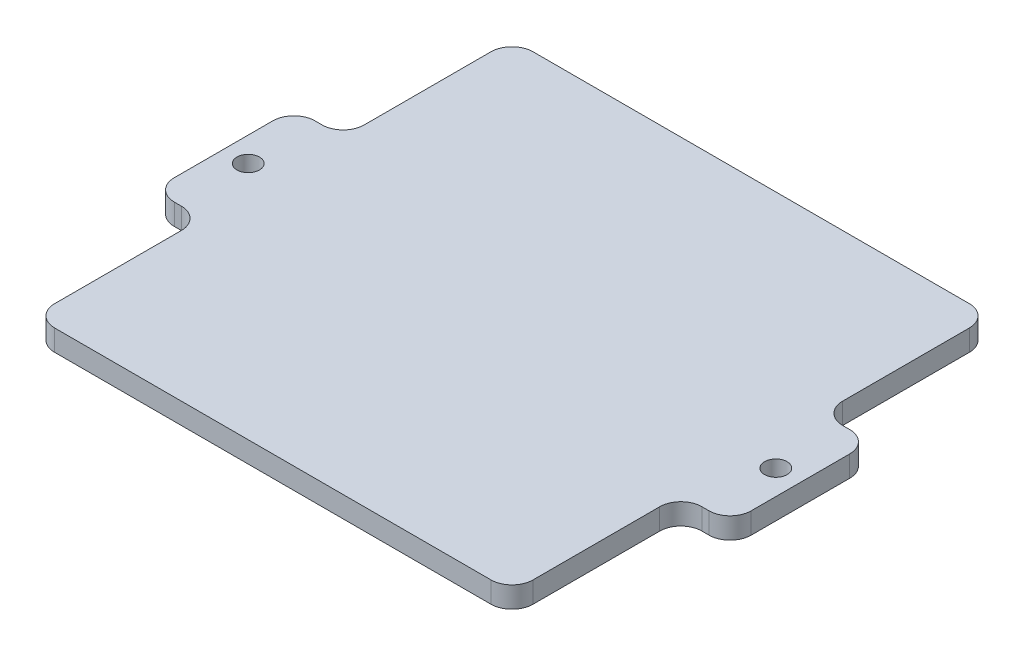
ISO-10303-21;
HEADER;
FILE_DESCRIPTION(('STEP AP214'),'2;1');
FILE_NAME('part.step','',(''),(''),'','','');
FILE_SCHEMA(('AUTOMOTIVE_DESIGN { 1 0 10303 214 1 1 1 1 }'));
ENDSEC;
DATA;
#1=APPLICATION_CONTEXT('core data for automotive mechanical design processes');
#2=APPLICATION_PROTOCOL_DEFINITION('international standard','automotive_design',2000,#1);
#3=PRODUCT_CONTEXT('',#1,'mechanical');
#4=PRODUCT('Part','Part','',(#3));
#5=PRODUCT_RELATED_PRODUCT_CATEGORY('part','',(#4));
#6=PRODUCT_DEFINITION_FORMATION('','',#4);
#7=PRODUCT_DEFINITION_CONTEXT('part definition',#1,'design');
#8=PRODUCT_DEFINITION('design','',#6,#7);
#9=PRODUCT_DEFINITION_SHAPE('','',#8);
#10=(LENGTH_UNIT() NAMED_UNIT(*) SI_UNIT(.MILLI.,.METRE.));
#11=(NAMED_UNIT(*) PLANE_ANGLE_UNIT() SI_UNIT($,.RADIAN.));
#12=(NAMED_UNIT(*) SI_UNIT($,.STERADIAN.) SOLID_ANGLE_UNIT());
#13=UNCERTAINTY_MEASURE_WITH_UNIT(LENGTH_MEASURE(1.E-05),#10,'distance_accuracy_value','');
#14=(GEOMETRIC_REPRESENTATION_CONTEXT(3) GLOBAL_UNCERTAINTY_ASSIGNED_CONTEXT((#13)) GLOBAL_UNIT_ASSIGNED_CONTEXT((#10,
#11,#12)) REPRESENTATION_CONTEXT('',''));
#15=CARTESIAN_POINT('',(0.,0.,0.));
#16=DIRECTION('',(0.,0.,1.));
#17=DIRECTION('',(1.,0.,0.));
#18=AXIS2_PLACEMENT_3D('',#15,#16,#17);
#19=CARTESIAN_POINT('',(-34.,3.,-34.));
#20=DIRECTION('',(1.,0.,0.));
#21=DIRECTION('',(0.,0.,-1.));
#22=AXIS2_PLACEMENT_3D('',#19,#20,#21);
#23=PLANE('',#22);
#24=DIRECTION('',(0.,0.,1.));
#25=VECTOR('',#24,1.);
#26=CARTESIAN_POINT('',(-34.,0.,-34.));
#27=LINE('',#26,#25);
#28=CARTESIAN_POINT('',(-34.,0.,13.));
#29=VERTEX_POINT('',#28);
#30=CARTESIAN_POINT('',(-34.,0.,31.));
#31=VERTEX_POINT('',#30);
#32=EDGE_CURVE('E229',#29,#31,#27,.T.);
#33=ORIENTED_EDGE('',*,*,#32,.T.);
#34=DIRECTION('',(0.,-1.,0.));
#35=VECTOR('',#34,1.);
#36=CARTESIAN_POINT('',(-34.,3.,31.));
#37=LINE('',#36,#35);
#38=CARTESIAN_POINT('',(-34.,3.,31.));
#39=VERTEX_POINT('',#38);
#40=EDGE_CURVE('E200',#31,#39,#37,.F.);
#41=ORIENTED_EDGE('',*,*,#40,.T.);
#42=DIRECTION('',(0.,0.,1.));
#43=VECTOR('',#42,1.);
#44=CARTESIAN_POINT('',(-34.,3.,-34.));
#45=LINE('',#44,#43);
#46=CARTESIAN_POINT('',(-34.,3.,13.));
#47=VERTEX_POINT('',#46);
#48=EDGE_CURVE('E264',#47,#39,#45,.T.);
#49=ORIENTED_EDGE('',*,*,#48,.F.);
#50=DIRECTION('',(0.,1.,0.));
#51=VECTOR('',#50,1.);
#52=CARTESIAN_POINT('',(-34.,3.,13.));
#53=LINE('',#52,#51);
#54=EDGE_CURVE('E205',#47,#29,#53,.F.);
#55=ORIENTED_EDGE('',*,*,#54,.T.);
#56=EDGE_LOOP('',(#33,#41,#49,#55));
#57=FACE_BOUND('',#56,.T.);
#58=ADVANCED_FACE('F33',(#57),#23,.F.);
#59=CARTESIAN_POINT('',(34.,3.,-34.));
#60=DIRECTION('',(-1.,0.,0.));
#61=DIRECTION('',(0.,0.,1.));
#62=AXIS2_PLACEMENT_3D('',#59,#60,#61);
#63=PLANE('',#62);
#64=DIRECTION('',(0.,0.,-1.));
#65=VECTOR('',#64,1.);
#66=CARTESIAN_POINT('',(34.,0.,-34.));
#67=LINE('',#66,#65);
#68=CARTESIAN_POINT('',(34.,0.,-13.));
#69=VERTEX_POINT('',#68);
#70=CARTESIAN_POINT('',(34.,0.,-31.));
#71=VERTEX_POINT('',#70);
#72=EDGE_CURVE('E275',#69,#71,#67,.T.);
#73=ORIENTED_EDGE('',*,*,#72,.T.);
#74=DIRECTION('',(0.,-1.,0.));
#75=VECTOR('',#74,1.);
#76=CARTESIAN_POINT('',(34.,3.,-31.));
#77=LINE('',#76,#75);
#78=CARTESIAN_POINT('',(34.,3.,-31.));
#79=VERTEX_POINT('',#78);
#80=EDGE_CURVE('E331',#71,#79,#77,.F.);
#81=ORIENTED_EDGE('',*,*,#80,.T.);
#82=DIRECTION('',(0.,0.,-1.));
#83=VECTOR('',#82,1.);
#84=CARTESIAN_POINT('',(34.,3.,-34.));
#85=LINE('',#84,#83);
#86=CARTESIAN_POINT('',(34.,3.,-13.));
#87=VERTEX_POINT('',#86);
#88=EDGE_CURVE('E222',#87,#79,#85,.T.);
#89=ORIENTED_EDGE('',*,*,#88,.F.);
#90=DIRECTION('',(0.,1.,0.));
#91=VECTOR('',#90,1.);
#92=CARTESIAN_POINT('',(34.,3.,-13.));
#93=LINE('',#92,#91);
#94=EDGE_CURVE('E329',#87,#69,#93,.F.);
#95=ORIENTED_EDGE('',*,*,#94,.T.);
#96=EDGE_LOOP('',(#73,#81,#89,#95));
#97=FACE_BOUND('',#96,.T.);
#98=ADVANCED_FACE('F488',(#97),#63,.F.);
#99=CARTESIAN_POINT('',(34.,3.,31.));
#100=VERTEX_POINT('',#99);
#101=CARTESIAN_POINT('',(34.,3.,13.));
#102=VERTEX_POINT('',#101);
#103=EDGE_CURVE('E226',#100,#102,#85,.T.);
#104=ORIENTED_EDGE('',*,*,#103,.F.);
#105=DIRECTION('',(0.,-1.,0.));
#106=VECTOR('',#105,1.);
#107=CARTESIAN_POINT('',(34.,3.,31.));
#108=LINE('',#107,#106);
#109=CARTESIAN_POINT('',(34.,0.,31.));
#110=VERTEX_POINT('',#109);
#111=EDGE_CURVE('E321',#100,#110,#108,.T.);
#112=ORIENTED_EDGE('',*,*,#111,.T.);
#113=CARTESIAN_POINT('',(34.,0.,13.));
#114=VERTEX_POINT('',#113);
#115=EDGE_CURVE('E278',#110,#114,#67,.T.);
#116=ORIENTED_EDGE('',*,*,#115,.T.);
#117=DIRECTION('',(0.,1.,0.));
#118=VECTOR('',#117,1.);
#119=CARTESIAN_POINT('',(34.,3.,13.));
#120=LINE('',#119,#118);
#121=EDGE_CURVE('E318',#114,#102,#120,.T.);
#122=ORIENTED_EDGE('',*,*,#121,.T.);
#123=EDGE_LOOP('',(#104,#112,#116,#122));
#124=FACE_BOUND('',#123,.T.);
#125=ADVANCED_FACE('F446',(#124),#63,.F.);
#126=CARTESIAN_POINT('',(-34.,3.,-34.));
#127=DIRECTION('',(0.,0.,1.));
#128=DIRECTION('',(1.,0.,0.));
#129=AXIS2_PLACEMENT_3D('',#126,#127,#128);
#130=PLANE('',#129);
#131=DIRECTION('',(-1.,0.,0.));
#132=VECTOR('',#131,1.);
#133=CARTESIAN_POINT('',(-34.,3.,-34.));
#134=LINE('',#133,#132);
#135=CARTESIAN_POINT('',(31.,3.,-34.));
#136=VERTEX_POINT('',#135);
#137=CARTESIAN_POINT('',(-31.,3.,-34.));
#138=VERTEX_POINT('',#137);
#139=EDGE_CURVE('E258',#136,#138,#134,.T.);
#140=ORIENTED_EDGE('',*,*,#139,.F.);
#141=DIRECTION('',(0.,-1.,0.));
#142=VECTOR('',#141,1.);
#143=CARTESIAN_POINT('',(31.,3.,-34.));
#144=LINE('',#143,#142);
#145=CARTESIAN_POINT('',(31.,0.,-34.));
#146=VERTEX_POINT('',#145);
#147=EDGE_CURVE('E326',#136,#146,#144,.T.);
#148=ORIENTED_EDGE('',*,*,#147,.T.);
#149=DIRECTION('',(-1.,0.,0.));
#150=VECTOR('',#149,1.);
#151=CARTESIAN_POINT('',(-34.,0.,-34.));
#152=LINE('',#151,#150);
#153=CARTESIAN_POINT('',(-31.,0.,-34.));
#154=VERTEX_POINT('',#153);
#155=EDGE_CURVE('E272',#146,#154,#152,.T.);
#156=ORIENTED_EDGE('',*,*,#155,.T.);
#157=DIRECTION('',(0.,-1.,0.));
#158=VECTOR('',#157,1.);
#159=CARTESIAN_POINT('',(-31.,3.,-34.));
#160=LINE('',#159,#158);
#161=EDGE_CURVE('E324',#154,#138,#160,.F.);
#162=ORIENTED_EDGE('',*,*,#161,.T.);
#163=EDGE_LOOP('',(#140,#148,#156,#162));
#164=FACE_BOUND('',#163,.T.);
#165=ADVANCED_FACE('F498',(#164),#130,.F.);
#166=CARTESIAN_POINT('',(-34.,3.,-31.));
#167=VERTEX_POINT('',#166);
#168=CARTESIAN_POINT('',(-34.,3.,-13.));
#169=VERTEX_POINT('',#168);
#170=EDGE_CURVE('E250',#167,#169,#45,.T.);
#171=ORIENTED_EDGE('',*,*,#170,.F.);
#172=DIRECTION('',(0.,-1.,0.));
#173=VECTOR('',#172,1.);
#174=CARTESIAN_POINT('',(-34.,3.,-31.));
#175=LINE('',#174,#173);
#176=CARTESIAN_POINT('',(-34.,0.,-31.));
#177=VERTEX_POINT('',#176);
#178=EDGE_CURVE('E336',#167,#177,#175,.T.);
#179=ORIENTED_EDGE('',*,*,#178,.T.);
#180=CARTESIAN_POINT('',(-34.,0.,-13.));
#181=VERTEX_POINT('',#180);
#182=EDGE_CURVE('E223',#177,#181,#27,.T.);
#183=ORIENTED_EDGE('',*,*,#182,.T.);
#184=DIRECTION('',(0.,1.,0.));
#185=VECTOR('',#184,1.);
#186=CARTESIAN_POINT('',(-34.,3.,-13.));
#187=LINE('',#186,#185);
#188=EDGE_CURVE('E333',#181,#169,#187,.T.);
#189=ORIENTED_EDGE('',*,*,#188,.T.);
#190=EDGE_LOOP('',(#171,#179,#183,#189));
#191=FACE_BOUND('',#190,.T.);
#192=ADVANCED_FACE('F394',(#191),#23,.F.);
#193=CARTESIAN_POINT('',(-34.,3.,34.));
#194=DIRECTION('',(0.,0.,-1.));
#195=DIRECTION('',(-1.,0.,0.));
#196=AXIS2_PLACEMENT_3D('',#193,#194,#195);
#197=PLANE('',#196);
#198=DIRECTION('',(1.,0.,0.));
#199=VECTOR('',#198,1.);
#200=CARTESIAN_POINT('',(-34.,3.,34.));
#201=LINE('',#200,#199);
#202=CARTESIAN_POINT('',(-31.,3.,34.));
#203=VERTEX_POINT('',#202);
#204=CARTESIAN_POINT('',(31.,3.,34.));
#205=VERTEX_POINT('',#204);
#206=EDGE_CURVE('E215',#203,#205,#201,.T.);
#207=ORIENTED_EDGE('',*,*,#206,.F.);
#208=DIRECTION('',(0.,-1.,0.));
#209=VECTOR('',#208,1.);
#210=CARTESIAN_POINT('',(-31.,3.,34.));
#211=LINE('',#210,#209);
#212=CARTESIAN_POINT('',(-31.,0.,34.));
#213=VERTEX_POINT('',#212);
#214=EDGE_CURVE('E199',#203,#213,#211,.T.);
#215=ORIENTED_EDGE('',*,*,#214,.T.);
#216=DIRECTION('',(1.,0.,0.));
#217=VECTOR('',#216,1.);
#218=CARTESIAN_POINT('',(-34.,0.,34.));
#219=LINE('',#218,#217);
#220=CARTESIAN_POINT('',(31.,0.,34.));
#221=VERTEX_POINT('',#220);
#222=EDGE_CURVE('E212',#213,#221,#219,.T.);
#223=ORIENTED_EDGE('',*,*,#222,.T.);
#224=DIRECTION('',(0.,-1.,0.));
#225=VECTOR('',#224,1.);
#226=CARTESIAN_POINT('',(31.,3.,34.));
#227=LINE('',#226,#225);
#228=EDGE_CURVE('E217',#221,#205,#227,.F.);
#229=ORIENTED_EDGE('',*,*,#228,.T.);
#230=EDGE_LOOP('',(#207,#215,#223,#229));
#231=FACE_BOUND('',#230,.T.);
#232=ADVANCED_FACE('F211',(#231),#197,.F.);
#233=CARTESIAN_POINT('',(0.,3.,0.));
#234=DIRECTION('',(0.,1.,0.));
#235=DIRECTION('',(0.,0.,1.));
#236=AXIS2_PLACEMENT_3D('',#233,#234,#235);
#237=PLANE('',#236);
#238=ORIENTED_EDGE('',*,*,#48,.T.);
#239=CARTESIAN_POINT('',(-31.,3.,31.));
#240=DIRECTION('',(0.,1.,0.));
#241=DIRECTION('',(0.,0.,1.));
#242=AXIS2_PLACEMENT_3D('',#239,#240,#241);
#243=CIRCLE('',#242,3.);
#244=EDGE_CURVE('E316',#39,#203,#243,.T.);
#245=ORIENTED_EDGE('',*,*,#244,.T.);
#246=ORIENTED_EDGE('',*,*,#206,.T.);
#247=CARTESIAN_POINT('',(31.,3.,31.));
#248=DIRECTION('',(0.,1.,0.));
#249=DIRECTION('',(0.,0.,1.));
#250=AXIS2_PLACEMENT_3D('',#247,#248,#249);
#251=CIRCLE('',#250,3.);
#252=EDGE_CURVE('E314',#205,#100,#251,.T.);
#253=ORIENTED_EDGE('',*,*,#252,.T.);
#254=ORIENTED_EDGE('',*,*,#103,.T.);
#255=CARTESIAN_POINT('',(37.,3.,13.));
#256=DIRECTION('',(0.,1.,0.));
#257=DIRECTION('',(0.,0.,1.));
#258=AXIS2_PLACEMENT_3D('',#255,#256,#257);
#259=CIRCLE('',#258,3.);
#260=CARTESIAN_POINT('',(37.,3.,10.));
#261=VERTEX_POINT('',#260);
#262=EDGE_CURVE('E368',#102,#261,#259,.F.);
#263=ORIENTED_EDGE('',*,*,#262,.T.);
#264=DIRECTION('',(1.,0.,0.));
#265=VECTOR('',#264,1.);
#266=CARTESIAN_POINT('',(41.,3.,10.));
#267=LINE('',#266,#265);
#268=CARTESIAN_POINT('',(38.,3.,10.));
#269=VERTEX_POINT('',#268);
#270=EDGE_CURVE('E245',#261,#269,#267,.T.);
#271=ORIENTED_EDGE('',*,*,#270,.T.);
#272=CARTESIAN_POINT('',(38.,3.,7.));
#273=DIRECTION('',(0.,1.,0.));
#274=DIRECTION('',(0.,0.,1.));
#275=AXIS2_PLACEMENT_3D('',#272,#273,#274);
#276=CIRCLE('',#275,3.);
#277=CARTESIAN_POINT('',(41.,3.,7.));
#278=VERTEX_POINT('',#277);
#279=EDGE_CURVE('E308',#269,#278,#276,.T.);
#280=ORIENTED_EDGE('',*,*,#279,.T.);
#281=DIRECTION('',(0.,0.,-1.));
#282=VECTOR('',#281,1.);
#283=CARTESIAN_POINT('',(41.,3.,-10.));
#284=LINE('',#283,#282);
#285=CARTESIAN_POINT('',(41.,3.,-7.));
#286=VERTEX_POINT('',#285);
#287=EDGE_CURVE('E244',#278,#286,#284,.T.);
#288=ORIENTED_EDGE('',*,*,#287,.T.);
#289=CARTESIAN_POINT('',(38.,3.,-7.));
#290=DIRECTION('',(0.,1.,0.));
#291=DIRECTION('',(0.,0.,1.));
#292=AXIS2_PLACEMENT_3D('',#289,#290,#291);
#293=CIRCLE('',#292,3.);
#294=CARTESIAN_POINT('',(38.,3.,-10.));
#295=VERTEX_POINT('',#294);
#296=EDGE_CURVE('E306',#286,#295,#293,.T.);
#297=ORIENTED_EDGE('',*,*,#296,.T.);
#298=DIRECTION('',(-1.,0.,0.));
#299=VECTOR('',#298,1.);
#300=CARTESIAN_POINT('',(41.,3.,-10.));
#301=LINE('',#300,#299);
#302=CARTESIAN_POINT('',(37.,3.,-10.));
#303=VERTEX_POINT('',#302);
#304=EDGE_CURVE('E240',#295,#303,#301,.T.);
#305=ORIENTED_EDGE('',*,*,#304,.T.);
#306=CARTESIAN_POINT('',(37.,3.,-13.));
#307=DIRECTION('',(0.,1.,0.));
#308=DIRECTION('',(0.,0.,1.));
#309=AXIS2_PLACEMENT_3D('',#306,#307,#308);
#310=CIRCLE('',#309,3.);
#311=EDGE_CURVE('E372',#303,#87,#310,.F.);
#312=ORIENTED_EDGE('',*,*,#311,.T.);
#313=ORIENTED_EDGE('',*,*,#88,.T.);
#314=CARTESIAN_POINT('',(31.,3.,-31.));
#315=DIRECTION('',(0.,1.,0.));
#316=DIRECTION('',(0.,0.,1.));
#317=AXIS2_PLACEMENT_3D('',#314,#315,#316);
#318=CIRCLE('',#317,3.);
#319=EDGE_CURVE('E312',#79,#136,#318,.T.);
#320=ORIENTED_EDGE('',*,*,#319,.T.);
#321=ORIENTED_EDGE('',*,*,#139,.T.);
#322=CARTESIAN_POINT('',(-31.,3.,-31.));
#323=DIRECTION('',(0.,1.,0.));
#324=DIRECTION('',(0.,0.,1.));
#325=AXIS2_PLACEMENT_3D('',#322,#323,#324);
#326=CIRCLE('',#325,3.);
#327=EDGE_CURVE('E310',#138,#167,#326,.T.);
#328=ORIENTED_EDGE('',*,*,#327,.T.);
#329=ORIENTED_EDGE('',*,*,#170,.T.);
#330=CARTESIAN_POINT('',(-37.,3.,-13.));
#331=DIRECTION('',(0.,1.,0.));
#332=DIRECTION('',(0.,0.,1.));
#333=AXIS2_PLACEMENT_3D('',#330,#331,#332);
#334=CIRCLE('',#333,3.);
#335=CARTESIAN_POINT('',(-37.,3.,-10.));
#336=VERTEX_POINT('',#335);
#337=EDGE_CURVE('E41',#169,#336,#334,.F.);
#338=ORIENTED_EDGE('',*,*,#337,.T.);
#339=DIRECTION('',(-1.,0.,0.));
#340=VECTOR('',#339,1.);
#341=CARTESIAN_POINT('',(-34.,3.,-10.));
#342=LINE('',#341,#340);
#343=CARTESIAN_POINT('',(-38.,3.,-10.));
#344=VERTEX_POINT('',#343);
#345=EDGE_CURVE('E297',#336,#344,#342,.T.);
#346=ORIENTED_EDGE('',*,*,#345,.T.);
#347=CARTESIAN_POINT('',(-38.,3.,-7.));
#348=DIRECTION('',(0.,1.,0.));
#349=DIRECTION('',(0.,0.,1.));
#350=AXIS2_PLACEMENT_3D('',#347,#348,#349);
#351=CIRCLE('',#350,3.);
#352=CARTESIAN_POINT('',(-41.,3.,-7.));
#353=VERTEX_POINT('',#352);
#354=EDGE_CURVE('E304',#344,#353,#351,.T.);
#355=ORIENTED_EDGE('',*,*,#354,.T.);
#356=DIRECTION('',(0.,0.,1.));
#357=VECTOR('',#356,1.);
#358=CARTESIAN_POINT('',(-41.,3.,-10.));
#359=LINE('',#358,#357);
#360=CARTESIAN_POINT('',(-41.,3.,7.));
#361=VERTEX_POINT('',#360);
#362=EDGE_CURVE('E302',#353,#361,#359,.T.);
#363=ORIENTED_EDGE('',*,*,#362,.T.);
#364=CARTESIAN_POINT('',(-38.,3.,7.));
#365=DIRECTION('',(0.,1.,0.));
#366=DIRECTION('',(0.,0.,1.));
#367=AXIS2_PLACEMENT_3D('',#364,#365,#366);
#368=CIRCLE('',#367,3.);
#369=CARTESIAN_POINT('',(-38.,3.,10.));
#370=VERTEX_POINT('',#369);
#371=EDGE_CURVE('E56',#361,#370,#368,.T.);
#372=ORIENTED_EDGE('',*,*,#371,.T.);
#373=DIRECTION('',(1.,0.,0.));
#374=VECTOR('',#373,1.);
#375=CARTESIAN_POINT('',(-34.,3.,10.));
#376=LINE('',#375,#374);
#377=CARTESIAN_POINT('',(-37.,3.,10.));
#378=VERTEX_POINT('',#377);
#379=EDGE_CURVE('E300',#370,#378,#376,.T.);
#380=ORIENTED_EDGE('',*,*,#379,.T.);
#381=CARTESIAN_POINT('',(-37.,3.,13.));
#382=DIRECTION('',(0.,1.,0.));
#383=DIRECTION('',(0.,0.,1.));
#384=AXIS2_PLACEMENT_3D('',#381,#382,#383);
#385=CIRCLE('',#384,3.);
#386=EDGE_CURVE('E48',#378,#47,#385,.F.);
#387=ORIENTED_EDGE('',*,*,#386,.T.);
#388=EDGE_LOOP('',(#238,#245,#246,#253,#254,#263,#271,#280,#288,#297,#305,#312,#313,#320,#321,
#328,#329,#338,#346,#355,#363,#372,#380,#387));
#389=FACE_BOUND('',#388,.T.);
#390=CARTESIAN_POINT('',(37.5,3.,0.));
#391=DIRECTION('',(0.,1.,0.));
#392=DIRECTION('',(0.,0.,1.));
#393=AXIS2_PLACEMENT_3D('',#390,#391,#392);
#394=CIRCLE('',#393,1.6);
#395=CARTESIAN_POINT('',(37.5,3.,1.6));
#396=VERTEX_POINT('',#395);
#397=EDGE_CURVE('E429',#396,#396,#394,.T.);
#398=ORIENTED_EDGE('',*,*,#397,.F.);
#399=EDGE_LOOP('',(#398));
#400=FACE_BOUND('',#399,.T.);
#401=CARTESIAN_POINT('',(-37.5,3.,0.));
#402=DIRECTION('',(0.,1.,0.));
#403=DIRECTION('',(0.,0.,1.));
#404=AXIS2_PLACEMENT_3D('',#401,#402,#403);
#405=CIRCLE('',#404,1.6);
#406=CARTESIAN_POINT('',(-37.5,3.,1.6));
#407=VERTEX_POINT('',#406);
#408=EDGE_CURVE('E472',#407,#407,#405,.T.);
#409=ORIENTED_EDGE('',*,*,#408,.F.);
#410=EDGE_LOOP('',(#409));
#411=FACE_BOUND('',#410,.T.);
#412=ADVANCED_FACE('F380',(#389,#400,#411),#237,.T.);
#413=CARTESIAN_POINT('',(0.,0.,0.));
#414=DIRECTION('',(0.,1.,0.));
#415=DIRECTION('',(0.,0.,1.));
#416=AXIS2_PLACEMENT_3D('',#413,#414,#415);
#417=PLANE('',#416);
#418=ORIENTED_EDGE('',*,*,#222,.F.);
#419=CARTESIAN_POINT('',(-31.,0.,31.));
#420=DIRECTION('',(0.,1.,0.));
#421=DIRECTION('',(0.,0.,1.));
#422=AXIS2_PLACEMENT_3D('',#419,#420,#421);
#423=CIRCLE('',#422,3.);
#424=EDGE_CURVE('E195',#213,#31,#423,.F.);
#425=ORIENTED_EDGE('',*,*,#424,.T.);
#426=ORIENTED_EDGE('',*,*,#32,.F.);
#427=CARTESIAN_POINT('',(-37.,0.,13.));
#428=DIRECTION('',(0.,1.,0.));
#429=DIRECTION('',(0.,0.,1.));
#430=AXIS2_PLACEMENT_3D('',#427,#428,#429);
#431=CIRCLE('',#430,3.);
#432=CARTESIAN_POINT('',(-37.,0.,10.));
#433=VERTEX_POINT('',#432);
#434=EDGE_CURVE('E377',#29,#433,#431,.T.);
#435=ORIENTED_EDGE('',*,*,#434,.T.);
#436=DIRECTION('',(-1.,0.,0.));
#437=VECTOR('',#436,1.);
#438=CARTESIAN_POINT('',(-34.,0.,10.));
#439=LINE('',#438,#437);
#440=CARTESIAN_POINT('',(-38.,0.,10.));
#441=VERTEX_POINT('',#440);
#442=EDGE_CURVE('E283',#433,#441,#439,.T.);
#443=ORIENTED_EDGE('',*,*,#442,.T.);
#444=CARTESIAN_POINT('',(-38.,0.,7.));
#445=DIRECTION('',(0.,1.,0.));
#446=DIRECTION('',(0.,0.,1.));
#447=AXIS2_PLACEMENT_3D('',#444,#445,#446);
#448=CIRCLE('',#447,3.);
#449=CARTESIAN_POINT('',(-41.,0.,7.));
#450=VERTEX_POINT('',#449);
#451=EDGE_CURVE('E216',#441,#450,#448,.F.);
#452=ORIENTED_EDGE('',*,*,#451,.T.);
#453=DIRECTION('',(0.,0.,-1.));
#454=VECTOR('',#453,1.);
#455=CARTESIAN_POINT('',(-41.,0.,-10.));
#456=LINE('',#455,#454);
#457=CARTESIAN_POINT('',(-41.,0.,-7.));
#458=VERTEX_POINT('',#457);
#459=EDGE_CURVE('E288',#450,#458,#456,.T.);
#460=ORIENTED_EDGE('',*,*,#459,.T.);
#461=CARTESIAN_POINT('',(-38.,0.,-7.));
#462=DIRECTION('',(0.,1.,0.));
#463=DIRECTION('',(0.,0.,1.));
#464=AXIS2_PLACEMENT_3D('',#461,#462,#463);
#465=CIRCLE('',#464,3.);
#466=CARTESIAN_POINT('',(-38.,0.,-10.));
#467=VERTEX_POINT('',#466);
#468=EDGE_CURVE('E411',#458,#467,#465,.F.);
#469=ORIENTED_EDGE('',*,*,#468,.T.);
#470=DIRECTION('',(1.,0.,0.));
#471=VECTOR('',#470,1.);
#472=CARTESIAN_POINT('',(-34.,0.,-10.));
#473=LINE('',#472,#471);
#474=CARTESIAN_POINT('',(-37.,0.,-10.));
#475=VERTEX_POINT('',#474);
#476=EDGE_CURVE('E289',#467,#475,#473,.T.);
#477=ORIENTED_EDGE('',*,*,#476,.T.);
#478=CARTESIAN_POINT('',(-37.,0.,-13.));
#479=DIRECTION('',(0.,1.,0.));
#480=DIRECTION('',(0.,0.,1.));
#481=AXIS2_PLACEMENT_3D('',#478,#479,#480);
#482=CIRCLE('',#481,3.);
#483=EDGE_CURVE('E11',#475,#181,#482,.T.);
#484=ORIENTED_EDGE('',*,*,#483,.T.);
#485=ORIENTED_EDGE('',*,*,#182,.F.);
#486=CARTESIAN_POINT('',(-31.,0.,-31.));
#487=DIRECTION('',(0.,1.,0.));
#488=DIRECTION('',(0.,0.,1.));
#489=AXIS2_PLACEMENT_3D('',#486,#487,#488);
#490=CIRCLE('',#489,3.);
#491=EDGE_CURVE('E400',#177,#154,#490,.F.);
#492=ORIENTED_EDGE('',*,*,#491,.T.);
#493=ORIENTED_EDGE('',*,*,#155,.F.);
#494=CARTESIAN_POINT('',(31.,0.,-31.));
#495=DIRECTION('',(0.,1.,0.));
#496=DIRECTION('',(0.,0.,1.));
#497=AXIS2_PLACEMENT_3D('',#494,#495,#496);
#498=CIRCLE('',#497,3.);
#499=EDGE_CURVE('E403',#146,#71,#498,.F.);
#500=ORIENTED_EDGE('',*,*,#499,.T.);
#501=ORIENTED_EDGE('',*,*,#72,.F.);
#502=CARTESIAN_POINT('',(37.,0.,-13.));
#503=DIRECTION('',(0.,1.,0.));
#504=DIRECTION('',(0.,0.,1.));
#505=AXIS2_PLACEMENT_3D('',#502,#503,#504);
#506=CIRCLE('',#505,3.);
#507=CARTESIAN_POINT('',(37.,0.,-10.));
#508=VERTEX_POINT('',#507);
#509=EDGE_CURVE('E374',#69,#508,#506,.T.);
#510=ORIENTED_EDGE('',*,*,#509,.T.);
#511=DIRECTION('',(1.,0.,0.));
#512=VECTOR('',#511,1.);
#513=CARTESIAN_POINT('',(41.,0.,-10.));
#514=LINE('',#513,#512);
#515=CARTESIAN_POINT('',(38.,0.,-10.));
#516=VERTEX_POINT('',#515);
#517=EDGE_CURVE('E416',#508,#516,#514,.T.);
#518=ORIENTED_EDGE('',*,*,#517,.T.);
#519=CARTESIAN_POINT('',(38.,0.,-7.));
#520=DIRECTION('',(0.,1.,0.));
#521=DIRECTION('',(0.,0.,1.));
#522=AXIS2_PLACEMENT_3D('',#519,#520,#521);
#523=CIRCLE('',#522,3.);
#524=CARTESIAN_POINT('',(41.,0.,-7.));
#525=VERTEX_POINT('',#524);
#526=EDGE_CURVE('E407',#516,#525,#523,.F.);
#527=ORIENTED_EDGE('',*,*,#526,.T.);
#528=DIRECTION('',(0.,0.,1.));
#529=VECTOR('',#528,1.);
#530=CARTESIAN_POINT('',(41.,0.,-10.));
#531=LINE('',#530,#529);
#532=CARTESIAN_POINT('',(41.,0.,7.));
#533=VERTEX_POINT('',#532);
#534=EDGE_CURVE('E243',#525,#533,#531,.T.);
#535=ORIENTED_EDGE('',*,*,#534,.T.);
#536=CARTESIAN_POINT('',(38.,0.,7.));
#537=DIRECTION('',(0.,1.,0.));
#538=DIRECTION('',(0.,0.,1.));
#539=AXIS2_PLACEMENT_3D('',#536,#537,#538);
#540=CIRCLE('',#539,3.);
#541=CARTESIAN_POINT('',(38.,0.,10.));
#542=VERTEX_POINT('',#541);
#543=EDGE_CURVE('E404',#533,#542,#540,.F.);
#544=ORIENTED_EDGE('',*,*,#543,.T.);
#545=DIRECTION('',(-1.,0.,0.));
#546=VECTOR('',#545,1.);
#547=CARTESIAN_POINT('',(41.,0.,10.));
#548=LINE('',#547,#546);
#549=CARTESIAN_POINT('',(37.,0.,10.));
#550=VERTEX_POINT('',#549);
#551=EDGE_CURVE('E414',#542,#550,#548,.T.);
#552=ORIENTED_EDGE('',*,*,#551,.T.);
#553=CARTESIAN_POINT('',(37.,0.,13.));
#554=DIRECTION('',(0.,1.,0.));
#555=DIRECTION('',(0.,0.,1.));
#556=AXIS2_PLACEMENT_3D('',#553,#554,#555);
#557=CIRCLE('',#556,3.);
#558=EDGE_CURVE('E370',#550,#114,#557,.T.);
#559=ORIENTED_EDGE('',*,*,#558,.T.);
#560=ORIENTED_EDGE('',*,*,#115,.F.);
#561=CARTESIAN_POINT('',(31.,0.,31.));
#562=DIRECTION('',(0.,1.,0.));
#563=DIRECTION('',(0.,0.,1.));
#564=AXIS2_PLACEMENT_3D('',#561,#562,#563);
#565=CIRCLE('',#564,3.);
#566=EDGE_CURVE('E206',#110,#221,#565,.F.);
#567=ORIENTED_EDGE('',*,*,#566,.T.);
#568=EDGE_LOOP('',(#418,#425,#426,#435,#443,#452,#460,#469,#477,#484,#485,#492,#493,#500,#501,
#510,#518,#527,#535,#544,#552,#559,#560,#567));
#569=FACE_BOUND('',#568,.T.);
#570=CARTESIAN_POINT('',(37.5,0.,0.));
#571=DIRECTION('',(0.,1.,0.));
#572=DIRECTION('',(0.,0.,1.));
#573=AXIS2_PLACEMENT_3D('',#570,#571,#572);
#574=CIRCLE('',#573,1.6);
#575=CARTESIAN_POINT('',(37.5,0.,1.6));
#576=VERTEX_POINT('',#575);
#577=EDGE_CURVE('E256',#576,#576,#574,.F.);
#578=ORIENTED_EDGE('',*,*,#577,.F.);
#579=EDGE_LOOP('',(#578));
#580=FACE_BOUND('',#579,.T.);
#581=CARTESIAN_POINT('',(-37.5,0.,0.));
#582=DIRECTION('',(0.,1.,0.));
#583=DIRECTION('',(0.,0.,1.));
#584=AXIS2_PLACEMENT_3D('',#581,#582,#583);
#585=CIRCLE('',#584,1.6);
#586=CARTESIAN_POINT('',(-37.5,0.,1.6));
#587=VERTEX_POINT('',#586);
#588=EDGE_CURVE('E287',#587,#587,#585,.F.);
#589=ORIENTED_EDGE('',*,*,#588,.F.);
#590=EDGE_LOOP('',(#589));
#591=FACE_BOUND('',#590,.T.);
#592=ADVANCED_FACE('F219',(#569,#580,#591),#417,.F.);
#593=CARTESIAN_POINT('',(41.,-21.1896201004171,10.));
#594=DIRECTION('',(0.,0.,1.));
#595=DIRECTION('',(1.,0.,0.));
#596=AXIS2_PLACEMENT_3D('',#593,#594,#595);
#597=PLANE('',#596);
#598=ORIENTED_EDGE('',*,*,#270,.F.);
#599=DIRECTION('',(0.,1.,0.));
#600=VECTOR('',#599,1.);
#601=CARTESIAN_POINT('',(37.,-21.1896201004171,10.));
#602=LINE('',#601,#600);
#603=EDGE_CURVE('E342',#261,#550,#602,.F.);
#604=ORIENTED_EDGE('',*,*,#603,.T.);
#605=ORIENTED_EDGE('',*,*,#551,.F.);
#606=DIRECTION('',(0.,1.,0.));
#607=VECTOR('',#606,1.);
#608=CARTESIAN_POINT('',(38.,-21.1896201004171,10.));
#609=LINE('',#608,#607);
#610=EDGE_CURVE('E339',#542,#269,#609,.T.);
#611=ORIENTED_EDGE('',*,*,#610,.T.);
#612=EDGE_LOOP('',(#598,#604,#605,#611));
#613=FACE_BOUND('',#612,.T.);
#614=ADVANCED_FACE('F437',(#613),#597,.T.);
#615=CARTESIAN_POINT('',(41.,-21.1896201004171,-10.));
#616=DIRECTION('',(1.,0.,0.));
#617=DIRECTION('',(0.,0.,-1.));
#618=AXIS2_PLACEMENT_3D('',#615,#616,#617);
#619=PLANE('',#618);
#620=ORIENTED_EDGE('',*,*,#287,.F.);
#621=DIRECTION('',(0.,1.,0.));
#622=VECTOR('',#621,1.);
#623=CARTESIAN_POINT('',(41.,-21.1896201004171,7.));
#624=LINE('',#623,#622);
#625=EDGE_CURVE('E347',#278,#533,#624,.F.);
#626=ORIENTED_EDGE('',*,*,#625,.T.);
#627=ORIENTED_EDGE('',*,*,#534,.F.);
#628=DIRECTION('',(0.,1.,0.));
#629=VECTOR('',#628,1.);
#630=CARTESIAN_POINT('',(41.,-21.1896201004171,-7.));
#631=LINE('',#630,#629);
#632=EDGE_CURVE('E344',#525,#286,#631,.T.);
#633=ORIENTED_EDGE('',*,*,#632,.T.);
#634=EDGE_LOOP('',(#620,#626,#627,#633));
#635=FACE_BOUND('',#634,.T.);
#636=ADVANCED_FACE('F533',(#635),#619,.T.);
#637=CARTESIAN_POINT('',(41.,-21.1896201004171,-10.));
#638=DIRECTION('',(0.,0.,-1.));
#639=DIRECTION('',(-1.,0.,0.));
#640=AXIS2_PLACEMENT_3D('',#637,#638,#639);
#641=PLANE('',#640);
#642=ORIENTED_EDGE('',*,*,#304,.F.);
#643=DIRECTION('',(0.,1.,0.));
#644=VECTOR('',#643,1.);
#645=CARTESIAN_POINT('',(38.,-21.1896201004171,-10.));
#646=LINE('',#645,#644);
#647=EDGE_CURVE('E352',#295,#516,#646,.F.);
#648=ORIENTED_EDGE('',*,*,#647,.T.);
#649=ORIENTED_EDGE('',*,*,#517,.F.);
#650=DIRECTION('',(0.,1.,0.));
#651=VECTOR('',#650,1.);
#652=CARTESIAN_POINT('',(37.,-21.1896201004171,-10.));
#653=LINE('',#652,#651);
#654=EDGE_CURVE('E349',#508,#303,#653,.T.);
#655=ORIENTED_EDGE('',*,*,#654,.T.);
#656=EDGE_LOOP('',(#642,#648,#649,#655));
#657=FACE_BOUND('',#656,.T.);
#658=ADVANCED_FACE('F536',(#657),#641,.T.);
#659=CARTESIAN_POINT('',(37.5,-21.1896201004171,0.));
#660=DIRECTION('',(0.,1.,0.));
#661=DIRECTION('',(0.,0.,1.));
#662=AXIS2_PLACEMENT_3D('',#659,#660,#661);
#663=CYLINDRICAL_SURFACE('',#662,1.6);
#664=ORIENTED_EDGE('',*,*,#577,.T.);
#665=EDGE_LOOP('',(#664));
#666=FACE_BOUND('',#665,.T.);
#667=ORIENTED_EDGE('',*,*,#397,.T.);
#668=EDGE_LOOP('',(#667));
#669=FACE_BOUND('',#668,.T.);
#670=ADVANCED_FACE('F542',(#666,#669),#663,.F.);
#671=CARTESIAN_POINT('',(-34.,-21.1896201004171,10.));
#672=DIRECTION('',(0.,0.,1.));
#673=DIRECTION('',(1.,0.,0.));
#674=AXIS2_PLACEMENT_3D('',#671,#672,#673);
#675=PLANE('',#674);
#676=ORIENTED_EDGE('',*,*,#379,.F.);
#677=DIRECTION('',(0.,1.,0.));
#678=VECTOR('',#677,1.);
#679=CARTESIAN_POINT('',(-38.,-21.1896201004171,10.));
#680=LINE('',#679,#678);
#681=EDGE_CURVE('E366',#370,#441,#680,.F.);
#682=ORIENTED_EDGE('',*,*,#681,.T.);
#683=ORIENTED_EDGE('',*,*,#442,.F.);
#684=DIRECTION('',(0.,1.,0.));
#685=VECTOR('',#684,1.);
#686=CARTESIAN_POINT('',(-37.,-21.1896201004171,10.));
#687=LINE('',#686,#685);
#688=EDGE_CURVE('E364',#433,#378,#687,.T.);
#689=ORIENTED_EDGE('',*,*,#688,.T.);
#690=EDGE_LOOP('',(#676,#682,#683,#689));
#691=FACE_BOUND('',#690,.T.);
#692=ADVANCED_FACE('F458',(#691),#675,.T.);
#693=CARTESIAN_POINT('',(-34.,-21.1896201004171,-10.));
#694=DIRECTION('',(0.,0.,-1.));
#695=DIRECTION('',(-1.,0.,0.));
#696=AXIS2_PLACEMENT_3D('',#693,#694,#695);
#697=PLANE('',#696);
#698=ORIENTED_EDGE('',*,*,#476,.F.);
#699=DIRECTION('',(0.,1.,0.));
#700=VECTOR('',#699,1.);
#701=CARTESIAN_POINT('',(-38.,-21.1896201004171,-10.));
#702=LINE('',#701,#700);
#703=EDGE_CURVE('E356',#467,#344,#702,.T.);
#704=ORIENTED_EDGE('',*,*,#703,.T.);
#705=ORIENTED_EDGE('',*,*,#345,.F.);
#706=DIRECTION('',(0.,1.,0.));
#707=VECTOR('',#706,1.);
#708=CARTESIAN_POINT('',(-37.,-21.1896201004171,-10.));
#709=LINE('',#708,#707);
#710=EDGE_CURVE('E354',#336,#475,#709,.F.);
#711=ORIENTED_EDGE('',*,*,#710,.T.);
#712=EDGE_LOOP('',(#698,#704,#705,#711));
#713=FACE_BOUND('',#712,.T.);
#714=ADVANCED_FACE('F388',(#713),#697,.T.);
#715=CARTESIAN_POINT('',(-41.,-21.1896201004171,-10.));
#716=DIRECTION('',(-1.,0.,0.));
#717=DIRECTION('',(0.,0.,1.));
#718=AXIS2_PLACEMENT_3D('',#715,#716,#717);
#719=PLANE('',#718);
#720=ORIENTED_EDGE('',*,*,#362,.F.);
#721=DIRECTION('',(0.,1.,0.));
#722=VECTOR('',#721,1.);
#723=CARTESIAN_POINT('',(-41.,-21.1896201004171,-7.));
#724=LINE('',#723,#722);
#725=EDGE_CURVE('E362',#353,#458,#724,.F.);
#726=ORIENTED_EDGE('',*,*,#725,.T.);
#727=ORIENTED_EDGE('',*,*,#459,.F.);
#728=DIRECTION('',(0.,1.,0.));
#729=VECTOR('',#728,1.);
#730=CARTESIAN_POINT('',(-41.,-21.1896201004171,7.));
#731=LINE('',#730,#729);
#732=EDGE_CURVE('E359',#450,#361,#731,.T.);
#733=ORIENTED_EDGE('',*,*,#732,.T.);
#734=EDGE_LOOP('',(#720,#726,#727,#733));
#735=FACE_BOUND('',#734,.T.);
#736=ADVANCED_FACE('F468',(#735),#719,.T.);
#737=CARTESIAN_POINT('',(-37.5,-21.1896201004171,0.));
#738=DIRECTION('',(0.,1.,0.));
#739=DIRECTION('',(0.,0.,1.));
#740=AXIS2_PLACEMENT_3D('',#737,#738,#739);
#741=CYLINDRICAL_SURFACE('',#740,1.6);
#742=ORIENTED_EDGE('',*,*,#588,.T.);
#743=EDGE_LOOP('',(#742));
#744=FACE_BOUND('',#743,.T.);
#745=ORIENTED_EDGE('',*,*,#408,.T.);
#746=EDGE_LOOP('',(#745));
#747=FACE_BOUND('',#746,.T.);
#748=ADVANCED_FACE('F511',(#744,#747),#741,.F.);
#749=CARTESIAN_POINT('',(-31.,3.,31.));
#750=DIRECTION('',(0.,-1.,0.));
#751=DIRECTION('',(0.,0.,-1.));
#752=AXIS2_PLACEMENT_3D('',#749,#750,#751);
#753=CYLINDRICAL_SURFACE('',#752,3.);
#754=ORIENTED_EDGE('',*,*,#244,.F.);
#755=ORIENTED_EDGE('',*,*,#40,.F.);
#756=ORIENTED_EDGE('',*,*,#424,.F.);
#757=ORIENTED_EDGE('',*,*,#214,.F.);
#758=EDGE_LOOP('',(#754,#755,#756,#757));
#759=FACE_BOUND('',#758,.T.);
#760=ADVANCED_FACE('F198',(#759),#753,.T.);
#761=CARTESIAN_POINT('',(31.,3.,31.));
#762=DIRECTION('',(0.,-1.,0.));
#763=DIRECTION('',(0.,0.,-1.));
#764=AXIS2_PLACEMENT_3D('',#761,#762,#763);
#765=CYLINDRICAL_SURFACE('',#764,3.);
#766=ORIENTED_EDGE('',*,*,#252,.F.);
#767=ORIENTED_EDGE('',*,*,#228,.F.);
#768=ORIENTED_EDGE('',*,*,#566,.F.);
#769=ORIENTED_EDGE('',*,*,#111,.F.);
#770=EDGE_LOOP('',(#766,#767,#768,#769));
#771=FACE_BOUND('',#770,.T.);
#772=ADVANCED_FACE('F450',(#771),#765,.T.);
#773=CARTESIAN_POINT('',(31.,3.,-31.));
#774=DIRECTION('',(0.,-1.,0.));
#775=DIRECTION('',(0.,0.,-1.));
#776=AXIS2_PLACEMENT_3D('',#773,#774,#775);
#777=CYLINDRICAL_SURFACE('',#776,3.);
#778=ORIENTED_EDGE('',*,*,#319,.F.);
#779=ORIENTED_EDGE('',*,*,#80,.F.);
#780=ORIENTED_EDGE('',*,*,#499,.F.);
#781=ORIENTED_EDGE('',*,*,#147,.F.);
#782=EDGE_LOOP('',(#778,#779,#780,#781));
#783=FACE_BOUND('',#782,.T.);
#784=ADVANCED_FACE('F514',(#783),#777,.T.);
#785=CARTESIAN_POINT('',(-31.,3.,-31.));
#786=DIRECTION('',(0.,-1.,0.));
#787=DIRECTION('',(0.,0.,-1.));
#788=AXIS2_PLACEMENT_3D('',#785,#786,#787);
#789=CYLINDRICAL_SURFACE('',#788,3.);
#790=ORIENTED_EDGE('',*,*,#327,.F.);
#791=ORIENTED_EDGE('',*,*,#161,.F.);
#792=ORIENTED_EDGE('',*,*,#491,.F.);
#793=ORIENTED_EDGE('',*,*,#178,.F.);
#794=EDGE_LOOP('',(#790,#791,#792,#793));
#795=FACE_BOUND('',#794,.T.);
#796=ADVANCED_FACE('F398',(#795),#789,.T.);
#797=CARTESIAN_POINT('',(37.,3.,13.));
#798=DIRECTION('',(0.,1.,0.));
#799=DIRECTION('',(0.,0.,1.));
#800=AXIS2_PLACEMENT_3D('',#797,#798,#799);
#801=CYLINDRICAL_SURFACE('',#800,3.);
#802=ORIENTED_EDGE('',*,*,#558,.F.);
#803=ORIENTED_EDGE('',*,*,#603,.F.);
#804=ORIENTED_EDGE('',*,*,#262,.F.);
#805=ORIENTED_EDGE('',*,*,#121,.F.);
#806=EDGE_LOOP('',(#802,#803,#804,#805));
#807=FACE_BOUND('',#806,.T.);
#808=ADVANCED_FACE('F442',(#807),#801,.F.);
#809=CARTESIAN_POINT('',(38.,-21.1896201004171,7.));
#810=DIRECTION('',(0.,1.,0.));
#811=DIRECTION('',(0.,0.,1.));
#812=AXIS2_PLACEMENT_3D('',#809,#810,#811);
#813=CYLINDRICAL_SURFACE('',#812,3.);
#814=ORIENTED_EDGE('',*,*,#543,.F.);
#815=ORIENTED_EDGE('',*,*,#625,.F.);
#816=ORIENTED_EDGE('',*,*,#279,.F.);
#817=ORIENTED_EDGE('',*,*,#610,.F.);
#818=EDGE_LOOP('',(#814,#815,#816,#817));
#819=FACE_BOUND('',#818,.T.);
#820=ADVANCED_FACE('F522',(#819),#813,.T.);
#821=CARTESIAN_POINT('',(38.,-21.1896201004171,-7.));
#822=DIRECTION('',(0.,1.,0.));
#823=DIRECTION('',(0.,0.,1.));
#824=AXIS2_PLACEMENT_3D('',#821,#822,#823);
#825=CYLINDRICAL_SURFACE('',#824,3.);
#826=ORIENTED_EDGE('',*,*,#526,.F.);
#827=ORIENTED_EDGE('',*,*,#647,.F.);
#828=ORIENTED_EDGE('',*,*,#296,.F.);
#829=ORIENTED_EDGE('',*,*,#632,.F.);
#830=EDGE_LOOP('',(#826,#827,#828,#829));
#831=FACE_BOUND('',#830,.T.);
#832=ADVANCED_FACE('F484',(#831),#825,.T.);
#833=CARTESIAN_POINT('',(37.,-21.1896201004171,-13.));
#834=DIRECTION('',(0.,1.,0.));
#835=DIRECTION('',(0.,0.,1.));
#836=AXIS2_PLACEMENT_3D('',#833,#834,#835);
#837=CYLINDRICAL_SURFACE('',#836,3.);
#838=ORIENTED_EDGE('',*,*,#509,.F.);
#839=ORIENTED_EDGE('',*,*,#94,.F.);
#840=ORIENTED_EDGE('',*,*,#311,.F.);
#841=ORIENTED_EDGE('',*,*,#654,.F.);
#842=EDGE_LOOP('',(#838,#839,#840,#841));
#843=FACE_BOUND('',#842,.T.);
#844=ADVANCED_FACE('F477',(#843),#837,.F.);
#845=CARTESIAN_POINT('',(-38.,-21.1896201004171,-7.));
#846=DIRECTION('',(0.,1.,0.));
#847=DIRECTION('',(0.,0.,1.));
#848=AXIS2_PLACEMENT_3D('',#845,#846,#847);
#849=CYLINDRICAL_SURFACE('',#848,3.);
#850=ORIENTED_EDGE('',*,*,#468,.F.);
#851=ORIENTED_EDGE('',*,*,#725,.F.);
#852=ORIENTED_EDGE('',*,*,#354,.F.);
#853=ORIENTED_EDGE('',*,*,#703,.F.);
#854=EDGE_LOOP('',(#850,#851,#852,#853));
#855=FACE_BOUND('',#854,.T.);
#856=ADVANCED_FACE('F475',(#855),#849,.T.);
#857=CARTESIAN_POINT('',(-38.,-21.1896201004171,7.));
#858=DIRECTION('',(0.,1.,0.));
#859=DIRECTION('',(0.,0.,1.));
#860=AXIS2_PLACEMENT_3D('',#857,#858,#859);
#861=CYLINDRICAL_SURFACE('',#860,3.);
#862=ORIENTED_EDGE('',*,*,#451,.F.);
#863=ORIENTED_EDGE('',*,*,#681,.F.);
#864=ORIENTED_EDGE('',*,*,#371,.F.);
#865=ORIENTED_EDGE('',*,*,#732,.F.);
#866=EDGE_LOOP('',(#862,#863,#864,#865));
#867=FACE_BOUND('',#866,.T.);
#868=ADVANCED_FACE('F461',(#867),#861,.T.);
#869=CARTESIAN_POINT('',(-37.,-21.1896201004171,13.));
#870=DIRECTION('',(0.,1.,0.));
#871=DIRECTION('',(0.,0.,1.));
#872=AXIS2_PLACEMENT_3D('',#869,#870,#871);
#873=CYLINDRICAL_SURFACE('',#872,3.);
#874=ORIENTED_EDGE('',*,*,#434,.F.);
#875=ORIENTED_EDGE('',*,*,#54,.F.);
#876=ORIENTED_EDGE('',*,*,#386,.F.);
#877=ORIENTED_EDGE('',*,*,#688,.F.);
#878=EDGE_LOOP('',(#874,#875,#876,#877));
#879=FACE_BOUND('',#878,.T.);
#880=ADVANCED_FACE('F454',(#879),#873,.F.);
#881=CARTESIAN_POINT('',(-37.,3.,-13.));
#882=DIRECTION('',(0.,1.,0.));
#883=DIRECTION('',(0.,0.,1.));
#884=AXIS2_PLACEMENT_3D('',#881,#882,#883);
#885=CYLINDRICAL_SURFACE('',#884,3.);
#886=ORIENTED_EDGE('',*,*,#483,.F.);
#887=ORIENTED_EDGE('',*,*,#710,.F.);
#888=ORIENTED_EDGE('',*,*,#337,.F.);
#889=ORIENTED_EDGE('',*,*,#188,.F.);
#890=EDGE_LOOP('',(#886,#887,#888,#889));
#891=FACE_BOUND('',#890,.T.);
#892=ADVANCED_FACE('F35',(#891),#885,.F.);
#893=CLOSED_SHELL('',(#58,#98,#125,#165,#192,#232,#412,#592,#614,#636,#658,#670,#692,#714,#736,
#748,#760,#772,#784,#796,#808,#820,#832,#844,#856,#868,#880,#892));
#894=MANIFOLD_SOLID_BREP('B2',#893);
#895=ADVANCED_BREP_SHAPE_REPRESENTATION('',(#18,#894),#14);
#896=SHAPE_DEFINITION_REPRESENTATION(#9,#895);
ENDSEC;
END-ISO-10303-21;
